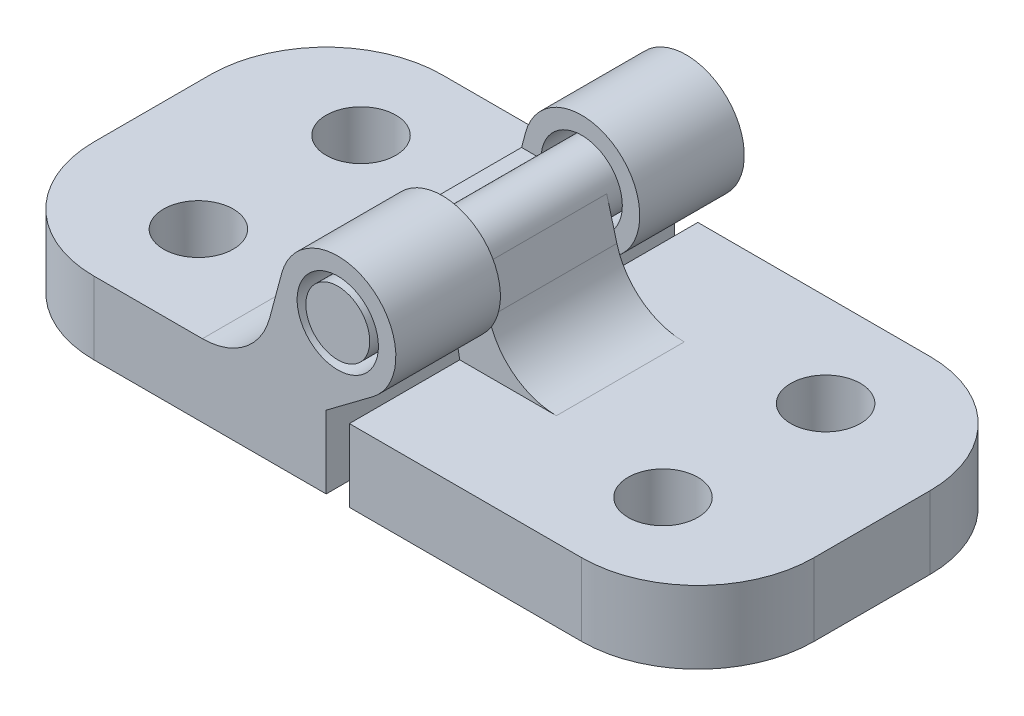
ISO-10303-21;
HEADER;
FILE_DESCRIPTION(('STEP AP214'),'2;1');
FILE_NAME('part.step','',(''),(''),'','','');
FILE_SCHEMA(('AUTOMOTIVE_DESIGN { 1 0 10303 214 1 1 1 1 }'));
ENDSEC;
DATA;
#1=APPLICATION_CONTEXT('core data for automotive mechanical design processes');
#2=APPLICATION_PROTOCOL_DEFINITION('international standard','automotive_design',2000,#1);
#3=PRODUCT_CONTEXT('',#1,'mechanical');
#4=PRODUCT('Part','Part','',(#3));
#5=PRODUCT_RELATED_PRODUCT_CATEGORY('part','',(#4));
#6=PRODUCT_DEFINITION_FORMATION('','',#4);
#7=PRODUCT_DEFINITION_CONTEXT('part definition',#1,'design');
#8=PRODUCT_DEFINITION('design','',#6,#7);
#9=PRODUCT_DEFINITION_SHAPE('','',#8);
#10=(LENGTH_UNIT() NAMED_UNIT(*) SI_UNIT(.MILLI.,.METRE.));
#11=(NAMED_UNIT(*) PLANE_ANGLE_UNIT() SI_UNIT($,.RADIAN.));
#12=(NAMED_UNIT(*) SI_UNIT($,.STERADIAN.) SOLID_ANGLE_UNIT());
#13=UNCERTAINTY_MEASURE_WITH_UNIT(LENGTH_MEASURE(1.E-05),#10,'distance_accuracy_value','');
#14=(GEOMETRIC_REPRESENTATION_CONTEXT(3) GLOBAL_UNCERTAINTY_ASSIGNED_CONTEXT((#13)) GLOBAL_UNIT_ASSIGNED_CONTEXT((#10,
#11,#12)) REPRESENTATION_CONTEXT('',''));
#15=CARTESIAN_POINT('',(0.,0.,0.));
#16=DIRECTION('',(0.,0.,1.));
#17=DIRECTION('',(1.,0.,0.));
#18=AXIS2_PLACEMENT_3D('',#15,#16,#17);
#19=CARTESIAN_POINT('',(15.501,3.375,2.75));
#20=DIRECTION('',(0.,0.,-1.));
#21=DIRECTION('',(-1.,0.,0.));
#22=AXIS2_PLACEMENT_3D('',#19,#20,#21);
#23=PLANE('',#22);
#24=CARTESIAN_POINT('',(0.,6.625,2.75));
#25=DIRECTION('',(0.,0.,-1.));
#26=DIRECTION('',(-1.,0.,0.));
#27=AXIS2_PLACEMENT_3D('',#24,#25,#26);
#28=CIRCLE('',#27,1.375);
#29=CARTESIAN_POINT('',(0.124312268872174,5.25563099939868,2.75));
#30=VERTEX_POINT('',#29);
#31=CARTESIAN_POINT('',(1.32814801114747,6.98087618701597,2.75));
#32=VERTEX_POINT('',#31);
#33=EDGE_CURVE('E209',#30,#32,#28,.F.);
#34=ORIENTED_EDGE('',*,*,#33,.F.);
#35=DIRECTION('',(-0.173648177666927,0.984807753012209,0.));
#36=VECTOR('',#35,1.);
#37=CARTESIAN_POINT('',(0.124312268872174,5.25563099939868,2.75));
#38=LINE('',#37,#36);
#39=CARTESIAN_POINT('',(0.499999999999995,3.125,2.75));
#40=VERTEX_POINT('',#39);
#41=EDGE_CURVE('E148',#40,#30,#38,.T.);
#42=ORIENTED_EDGE('',*,*,#41,.F.);
#43=DIRECTION('',(-1.,0.,0.));
#44=VECTOR('',#43,1.);
#45=CARTESIAN_POINT('',(0.499999999999996,3.125,2.75));
#46=LINE('',#45,#44);
#47=CARTESIAN_POINT('',(4.66330788550968,3.125,2.75));
#48=VERTEX_POINT('',#47);
#49=EDGE_CURVE('E72',#48,#40,#46,.T.);
#50=ORIENTED_EDGE('',*,*,#49,.F.);
#51=CARTESIAN_POINT('',(4.66330788550968,6.125,2.75));
#52=DIRECTION('',(0.,0.,-1.));
#53=DIRECTION('',(-1.,0.,0.));
#54=AXIS2_PLACEMENT_3D('',#51,#52,#53);
#55=CIRCLE('',#54,3.);
#56=CARTESIAN_POINT('',(1.76553040664248,5.34854286469243,2.75));
#57=VERTEX_POINT('',#56);
#58=EDGE_CURVE('E13',#48,#57,#55,.T.);
#59=ORIENTED_EDGE('',*,*,#58,.T.);
#60=DIRECTION('',(0.258819045102525,-0.965925826289067,0.));
#61=VECTOR('',#60,1.);
#62=CARTESIAN_POINT('',(2.36132692157281,3.125,2.75));
#63=LINE('',#62,#61);
#64=EDGE_CURVE('E150',#32,#57,#63,.T.);
#65=ORIENTED_EDGE('',*,*,#64,.F.);
#66=EDGE_LOOP('',(#34,#42,#50,#59,#65));
#67=FACE_BOUND('',#66,.T.);
#68=ADVANCED_FACE('F50',(#67),#23,.F.);
#69=CARTESIAN_POINT('',(0.,3.125,0.));
#70=DIRECTION('',(0.,1.,0.));
#71=DIRECTION('',(0.,0.,1.));
#72=AXIS2_PLACEMENT_3D('',#69,#70,#71);
#73=PLANE('',#72);
#74=CARTESIAN_POINT('',(10.,3.125,3.5));
#75=DIRECTION('',(0.,1.,0.));
#76=DIRECTION('',(0.,0.,1.));
#77=AXIS2_PLACEMENT_3D('',#74,#75,#76);
#78=CIRCLE('',#77,1.5);
#79=CARTESIAN_POINT('',(10.,3.125,5.));
#80=VERTEX_POINT('',#79);
#81=EDGE_CURVE('E306',#80,#80,#78,.T.);
#82=ORIENTED_EDGE('',*,*,#81,.F.);
#83=EDGE_LOOP('',(#82));
#84=FACE_BOUND('',#83,.T.);
#85=CARTESIAN_POINT('',(10.,3.125,-3.5));
#86=DIRECTION('',(0.,1.,0.));
#87=DIRECTION('',(0.,0.,-1.));
#88=AXIS2_PLACEMENT_3D('',#85,#86,#87);
#89=CIRCLE('',#88,1.5);
#90=CARTESIAN_POINT('',(10.,3.125,-5.));
#91=VERTEX_POINT('',#90);
#92=EDGE_CURVE('E319',#91,#91,#89,.T.);
#93=ORIENTED_EDGE('',*,*,#92,.F.);
#94=EDGE_LOOP('',(#93));
#95=FACE_BOUND('',#94,.T.);
#96=DIRECTION('',(-1.,0.,0.));
#97=VECTOR('',#96,1.);
#98=CARTESIAN_POINT('',(0.499999999999996,3.125,-2.75));
#99=LINE('',#98,#97);
#100=CARTESIAN_POINT('',(4.66330788550968,3.125,-2.75));
#101=VERTEX_POINT('',#100);
#102=CARTESIAN_POINT('',(0.499999999999996,3.125,-2.75));
#103=VERTEX_POINT('',#102);
#104=EDGE_CURVE('E65',#101,#103,#99,.T.);
#105=ORIENTED_EDGE('',*,*,#104,.F.);
#106=DIRECTION('',(0.,0.,-1.));
#107=VECTOR('',#106,1.);
#108=CARTESIAN_POINT('',(4.66330788550968,3.125,0.));
#109=LINE('',#108,#107);
#110=EDGE_CURVE('E187',#101,#48,#109,.F.);
#111=ORIENTED_EDGE('',*,*,#110,.T.);
#112=ORIENTED_EDGE('',*,*,#49,.T.);
#113=DIRECTION('',(0.,0.,-1.));
#114=VECTOR('',#113,1.);
#115=CARTESIAN_POINT('',(0.499999999999996,3.125,7.5));
#116=LINE('',#115,#114);
#117=CARTESIAN_POINT('',(0.499999999999996,3.125,7.5));
#118=VERTEX_POINT('',#117);
#119=EDGE_CURVE('E196',#118,#40,#116,.T.);
#120=ORIENTED_EDGE('',*,*,#119,.F.);
#121=DIRECTION('',(-1.,0.,0.));
#122=VECTOR('',#121,1.);
#123=CARTESIAN_POINT('',(15.5,3.125,7.5));
#124=LINE('',#123,#122);
#125=CARTESIAN_POINT('',(10.5,3.125,7.5));
#126=VERTEX_POINT('',#125);
#127=EDGE_CURVE('E220',#126,#118,#124,.T.);
#128=ORIENTED_EDGE('',*,*,#127,.F.);
#129=CARTESIAN_POINT('',(10.5,3.125,2.5));
#130=DIRECTION('',(0.,1.,0.));
#131=DIRECTION('',(0.,0.,1.));
#132=AXIS2_PLACEMENT_3D('',#129,#130,#131);
#133=CIRCLE('',#132,5.);
#134=CARTESIAN_POINT('',(15.5,3.125,2.5));
#135=VERTEX_POINT('',#134);
#136=EDGE_CURVE('E179',#126,#135,#133,.T.);
#137=ORIENTED_EDGE('',*,*,#136,.T.);
#138=DIRECTION('',(0.,0.,-1.));
#139=VECTOR('',#138,1.);
#140=CARTESIAN_POINT('',(15.5,3.125,7.5));
#141=LINE('',#140,#139);
#142=CARTESIAN_POINT('',(15.5,3.125,-2.5));
#143=VERTEX_POINT('',#142);
#144=EDGE_CURVE('E166',#135,#143,#141,.T.);
#145=ORIENTED_EDGE('',*,*,#144,.T.);
#146=CARTESIAN_POINT('',(10.5,3.125,-2.5));
#147=DIRECTION('',(0.,1.,0.));
#148=DIRECTION('',(0.,0.,1.));
#149=AXIS2_PLACEMENT_3D('',#146,#147,#148);
#150=CIRCLE('',#149,5.);
#151=CARTESIAN_POINT('',(10.5,3.125,-7.5));
#152=VERTEX_POINT('',#151);
#153=EDGE_CURVE('E177',#143,#152,#150,.T.);
#154=ORIENTED_EDGE('',*,*,#153,.T.);
#155=DIRECTION('',(-1.,0.,0.));
#156=VECTOR('',#155,1.);
#157=CARTESIAN_POINT('',(15.5,3.125,-7.5));
#158=LINE('',#157,#156);
#159=CARTESIAN_POINT('',(0.499999999999994,3.125,-7.5));
#160=VERTEX_POINT('',#159);
#161=EDGE_CURVE('E205',#152,#160,#158,.T.);
#162=ORIENTED_EDGE('',*,*,#161,.T.);
#163=EDGE_CURVE('E206',#103,#160,#116,.T.);
#164=ORIENTED_EDGE('',*,*,#163,.F.);
#165=EDGE_LOOP('',(#105,#111,#112,#120,#128,#137,#145,#154,#162,#164));
#166=FACE_BOUND('',#165,.T.);
#167=ADVANCED_FACE('F192',(#84,#95,#166),#73,.T.);
#168=CARTESIAN_POINT('',(15.5,3.125,7.5));
#169=DIRECTION('',(-1.,0.,0.));
#170=DIRECTION('',(0.,0.,1.));
#171=AXIS2_PLACEMENT_3D('',#168,#169,#170);
#172=PLANE('',#171);
#173=ORIENTED_EDGE('',*,*,#144,.F.);
#174=DIRECTION('',(0.,-1.,0.));
#175=VECTOR('',#174,1.);
#176=CARTESIAN_POINT('',(15.5,0.,2.5));
#177=LINE('',#176,#175);
#178=CARTESIAN_POINT('',(15.5,0.,2.5));
#179=VERTEX_POINT('',#178);
#180=EDGE_CURVE('E160',#135,#179,#177,.T.);
#181=ORIENTED_EDGE('',*,*,#180,.T.);
#182=DIRECTION('',(0.,0.,-1.));
#183=VECTOR('',#182,1.);
#184=CARTESIAN_POINT('',(15.5,0.,7.5));
#185=LINE('',#184,#183);
#186=CARTESIAN_POINT('',(15.5,0.,-2.5));
#187=VERTEX_POINT('',#186);
#188=EDGE_CURVE('E158',#179,#187,#185,.T.);
#189=ORIENTED_EDGE('',*,*,#188,.T.);
#190=DIRECTION('',(0.,-1.,0.));
#191=VECTOR('',#190,1.);
#192=CARTESIAN_POINT('',(15.5,3.125,-2.5));
#193=LINE('',#192,#191);
#194=EDGE_CURVE('E157',#187,#143,#193,.F.);
#195=ORIENTED_EDGE('',*,*,#194,.T.);
#196=EDGE_LOOP('',(#173,#181,#189,#195));
#197=FACE_BOUND('',#196,.T.);
#198=ADVANCED_FACE('F251',(#197),#172,.F.);
#199=CARTESIAN_POINT('',(15.5,3.125,-7.5));
#200=DIRECTION('',(0.,0.,1.));
#201=DIRECTION('',(1.,0.,0.));
#202=AXIS2_PLACEMENT_3D('',#199,#200,#201);
#203=PLANE('',#202);
#204=ORIENTED_EDGE('',*,*,#161,.F.);
#205=DIRECTION('',(0.,-1.,0.));
#206=VECTOR('',#205,1.);
#207=CARTESIAN_POINT('',(10.5,3.125,-7.5));
#208=LINE('',#207,#206);
#209=CARTESIAN_POINT('',(10.5,0.,-7.5));
#210=VERTEX_POINT('',#209);
#211=EDGE_CURVE('E181',#152,#210,#208,.T.);
#212=ORIENTED_EDGE('',*,*,#211,.T.);
#213=DIRECTION('',(-1.,0.,0.));
#214=VECTOR('',#213,1.);
#215=CARTESIAN_POINT('',(15.5,0.,-7.5));
#216=LINE('',#215,#214);
#217=CARTESIAN_POINT('',(0.499999999999994,0.,-7.5));
#218=VERTEX_POINT('',#217);
#219=EDGE_CURVE('E163',#210,#218,#216,.T.);
#220=ORIENTED_EDGE('',*,*,#219,.T.);
#221=DIRECTION('',(0.,-1.,0.));
#222=VECTOR('',#221,1.);
#223=CARTESIAN_POINT('',(0.499999999999994,3.125,-7.5));
#224=LINE('',#223,#222);
#225=EDGE_CURVE('E210',#160,#218,#224,.T.);
#226=ORIENTED_EDGE('',*,*,#225,.F.);
#227=EDGE_LOOP('',(#204,#212,#220,#226));
#228=FACE_BOUND('',#227,.T.);
#229=ADVANCED_FACE('F240',(#228),#203,.F.);
#230=CARTESIAN_POINT('',(0.499999999999996,3.125,7.5));
#231=DIRECTION('',(-1.,0.,0.));
#232=DIRECTION('',(0.,0.,1.));
#233=AXIS2_PLACEMENT_3D('',#230,#231,#232);
#234=PLANE('',#233);
#235=DIRECTION('',(0.,0.,-1.));
#236=VECTOR('',#235,1.);
#237=CARTESIAN_POINT('',(0.499999999999996,0.,7.5));
#238=LINE('',#237,#236);
#239=CARTESIAN_POINT('',(0.499999999999996,0.,7.5));
#240=VERTEX_POINT('',#239);
#241=EDGE_CURVE('E223',#240,#218,#238,.T.);
#242=ORIENTED_EDGE('',*,*,#241,.F.);
#243=DIRECTION('',(0.,-1.,0.));
#244=VECTOR('',#243,1.);
#245=CARTESIAN_POINT('',(0.499999999999996,3.125,7.5));
#246=LINE('',#245,#244);
#247=EDGE_CURVE('E204',#118,#240,#246,.T.);
#248=ORIENTED_EDGE('',*,*,#247,.F.);
#249=ORIENTED_EDGE('',*,*,#119,.T.);
#250=DIRECTION('',(0.,0.,-1.));
#251=VECTOR('',#250,1.);
#252=CARTESIAN_POINT('',(0.499999999999996,3.125,9.14213023835133));
#253=LINE('',#252,#251);
#254=EDGE_CURVE('E151',#40,#103,#253,.T.);
#255=ORIENTED_EDGE('',*,*,#254,.T.);
#256=ORIENTED_EDGE('',*,*,#163,.T.);
#257=ORIENTED_EDGE('',*,*,#225,.T.);
#258=EDGE_LOOP('',(#242,#248,#249,#255,#256,#257));
#259=FACE_BOUND('',#258,.T.);
#260=ADVANCED_FACE('F201',(#259),#234,.T.);
#261=CARTESIAN_POINT('',(15.5,3.125,7.5));
#262=DIRECTION('',(0.,0.,1.));
#263=DIRECTION('',(1.,0.,0.));
#264=AXIS2_PLACEMENT_3D('',#261,#262,#263);
#265=PLANE('',#264);
#266=DIRECTION('',(-1.,0.,0.));
#267=VECTOR('',#266,1.);
#268=CARTESIAN_POINT('',(15.5,0.,7.5));
#269=LINE('',#268,#267);
#270=CARTESIAN_POINT('',(10.5,0.,7.5));
#271=VERTEX_POINT('',#270);
#272=EDGE_CURVE('E221',#271,#240,#269,.T.);
#273=ORIENTED_EDGE('',*,*,#272,.F.);
#274=DIRECTION('',(0.,-1.,0.));
#275=VECTOR('',#274,1.);
#276=CARTESIAN_POINT('',(10.5,3.125,7.5));
#277=LINE('',#276,#275);
#278=EDGE_CURVE('E175',#271,#126,#277,.F.);
#279=ORIENTED_EDGE('',*,*,#278,.T.);
#280=ORIENTED_EDGE('',*,*,#127,.T.);
#281=ORIENTED_EDGE('',*,*,#247,.T.);
#282=EDGE_LOOP('',(#273,#279,#280,#281));
#283=FACE_BOUND('',#282,.T.);
#284=ADVANCED_FACE('F248',(#283),#265,.T.);
#285=CARTESIAN_POINT('',(0.,0.,0.));
#286=DIRECTION('',(0.,1.,0.));
#287=DIRECTION('',(0.,0.,1.));
#288=AXIS2_PLACEMENT_3D('',#285,#286,#287);
#289=PLANE('',#288);
#290=CARTESIAN_POINT('',(10.,0.,3.5));
#291=DIRECTION('',(0.,1.,0.));
#292=DIRECTION('',(0.,0.,1.));
#293=AXIS2_PLACEMENT_3D('',#290,#291,#292);
#294=CIRCLE('',#293,1.5);
#295=CARTESIAN_POINT('',(10.,0.,5.));
#296=VERTEX_POINT('',#295);
#297=EDGE_CURVE('E309',#296,#296,#294,.F.);
#298=ORIENTED_EDGE('',*,*,#297,.F.);
#299=EDGE_LOOP('',(#298));
#300=FACE_BOUND('',#299,.T.);
#301=CARTESIAN_POINT('',(10.,0.,-3.5));
#302=DIRECTION('',(0.,1.,0.));
#303=DIRECTION('',(0.,0.,1.));
#304=AXIS2_PLACEMENT_3D('',#301,#302,#303);
#305=CIRCLE('',#304,1.5);
#306=CARTESIAN_POINT('',(10.,0.,-2.));
#307=VERTEX_POINT('',#306);
#308=EDGE_CURVE('E316',#307,#307,#305,.F.);
#309=ORIENTED_EDGE('',*,*,#308,.F.);
#310=EDGE_LOOP('',(#309));
#311=FACE_BOUND('',#310,.T.);
#312=ORIENTED_EDGE('',*,*,#188,.F.);
#313=CARTESIAN_POINT('',(10.5,0.,2.5));
#314=DIRECTION('',(0.,1.,0.));
#315=DIRECTION('',(0.,0.,1.));
#316=AXIS2_PLACEMENT_3D('',#313,#314,#315);
#317=CIRCLE('',#316,5.);
#318=EDGE_CURVE('E173',#179,#271,#317,.F.);
#319=ORIENTED_EDGE('',*,*,#318,.T.);
#320=ORIENTED_EDGE('',*,*,#272,.T.);
#321=ORIENTED_EDGE('',*,*,#241,.T.);
#322=ORIENTED_EDGE('',*,*,#219,.F.);
#323=CARTESIAN_POINT('',(10.5,0.,-2.5));
#324=DIRECTION('',(0.,1.,0.));
#325=DIRECTION('',(0.,0.,1.));
#326=AXIS2_PLACEMENT_3D('',#323,#324,#325);
#327=CIRCLE('',#326,5.);
#328=EDGE_CURVE('E171',#210,#187,#327,.F.);
#329=ORIENTED_EDGE('',*,*,#328,.T.);
#330=EDGE_LOOP('',(#312,#319,#320,#321,#322,#329));
#331=FACE_BOUND('',#330,.T.);
#332=ADVANCED_FACE('F244',(#300,#311,#331),#289,.F.);
#333=CARTESIAN_POINT('',(2.36132692157281,3.125,9.14213023835133));
#334=DIRECTION('',(-0.965925826289067,-0.258819045102525,0.));
#335=DIRECTION('',(0.258819045102525,-0.965925826289067,0.));
#336=AXIS2_PLACEMENT_3D('',#333,#334,#335);
#337=PLANE('',#336);
#338=ORIENTED_EDGE('',*,*,#64,.T.);
#339=DIRECTION('',(0.,0.,-1.));
#340=VECTOR('',#339,1.);
#341=CARTESIAN_POINT('',(1.76553040664248,5.34854286469243,9.14213023835133));
#342=LINE('',#341,#340);
#343=CARTESIAN_POINT('',(1.76553040664248,5.34854286469243,-2.75));
#344=VERTEX_POINT('',#343);
#345=EDGE_CURVE('E184',#57,#344,#342,.T.);
#346=ORIENTED_EDGE('',*,*,#345,.T.);
#347=DIRECTION('',(0.258819045102525,-0.965925826289067,0.));
#348=VECTOR('',#347,1.);
#349=CARTESIAN_POINT('',(2.36132692157281,3.125,-2.75));
#350=LINE('',#349,#348);
#351=CARTESIAN_POINT('',(1.32814801114747,6.98087618701597,-2.75));
#352=VERTEX_POINT('',#351);
#353=EDGE_CURVE('E142',#352,#344,#350,.T.);
#354=ORIENTED_EDGE('',*,*,#353,.F.);
#355=DIRECTION('',(0.,0.,-1.));
#356=VECTOR('',#355,1.);
#357=CARTESIAN_POINT('',(1.32814801114747,6.98087618701597,9.14213023835133));
#358=LINE('',#357,#356);
#359=EDGE_CURVE('E141',#32,#352,#358,.T.);
#360=ORIENTED_EDGE('',*,*,#359,.F.);
#361=EDGE_LOOP('',(#338,#346,#354,#360));
#362=FACE_BOUND('',#361,.T.);
#363=ADVANCED_FACE('F272',(#362),#337,.F.);
#364=CARTESIAN_POINT('',(0.124312268872174,5.25563099939868,9.14213023835133));
#365=DIRECTION('',(0.984807753012209,0.173648177666927,0.));
#366=DIRECTION('',(-0.173648177666927,0.984807753012209,0.));
#367=AXIS2_PLACEMENT_3D('',#364,#365,#366);
#368=PLANE('',#367);
#369=ORIENTED_EDGE('',*,*,#254,.F.);
#370=ORIENTED_EDGE('',*,*,#41,.T.);
#371=DIRECTION('',(0.,0.,-1.));
#372=VECTOR('',#371,1.);
#373=CARTESIAN_POINT('',(0.124312268872174,5.25563099939868,9.14213023835133));
#374=LINE('',#373,#372);
#375=CARTESIAN_POINT('',(0.124312268872174,5.25563099939868,-2.75));
#376=VERTEX_POINT('',#375);
#377=EDGE_CURVE('E146',#30,#376,#374,.T.);
#378=ORIENTED_EDGE('',*,*,#377,.T.);
#379=DIRECTION('',(-0.173648177666927,0.984807753012209,0.));
#380=VECTOR('',#379,1.);
#381=CARTESIAN_POINT('',(0.124312268872174,5.25563099939868,-2.75));
#382=LINE('',#381,#380);
#383=EDGE_CURVE('E132',#103,#376,#382,.T.);
#384=ORIENTED_EDGE('',*,*,#383,.F.);
#385=EDGE_LOOP('',(#369,#370,#378,#384));
#386=FACE_BOUND('',#385,.T.);
#387=ADVANCED_FACE('F147',(#386),#368,.F.);
#388=CARTESIAN_POINT('',(0.,6.625,9.14213023835133));
#389=DIRECTION('',(0.,0.,-1.));
#390=DIRECTION('',(-1.,0.,0.));
#391=AXIS2_PLACEMENT_3D('',#388,#389,#390);
#392=CYLINDRICAL_SURFACE('',#391,1.375);
#393=ORIENTED_EDGE('',*,*,#377,.F.);
#394=ORIENTED_EDGE('',*,*,#33,.T.);
#395=ORIENTED_EDGE('',*,*,#359,.T.);
#396=CARTESIAN_POINT('',(0.,6.625,-2.75));
#397=DIRECTION('',(0.,0.,1.));
#398=DIRECTION('',(1.,0.,0.));
#399=AXIS2_PLACEMENT_3D('',#396,#397,#398);
#400=CIRCLE('',#399,1.375);
#401=EDGE_CURVE('E137',#352,#376,#400,.F.);
#402=ORIENTED_EDGE('',*,*,#401,.T.);
#403=EDGE_LOOP('',(#393,#394,#395,#402));
#404=FACE_BOUND('',#403,.T.);
#405=CARTESIAN_POINT('',(0.,6.625,-7.5));
#406=DIRECTION('',(0.,0.,-1.));
#407=DIRECTION('',(-1.,0.,0.));
#408=AXIS2_PLACEMENT_3D('',#405,#406,#407);
#409=CIRCLE('',#408,1.375);
#410=CARTESIAN_POINT('',(-1.375,6.625,-7.5));
#411=VERTEX_POINT('',#410);
#412=EDGE_CURVE('E311',#411,#411,#409,.F.);
#413=ORIENTED_EDGE('',*,*,#412,.T.);
#414=EDGE_LOOP('',(#413));
#415=FACE_BOUND('',#414,.T.);
#416=CARTESIAN_POINT('',(0.,6.625,7.5));
#417=DIRECTION('',(0.,0.,-1.));
#418=DIRECTION('',(-1.,0.,0.));
#419=AXIS2_PLACEMENT_3D('',#416,#417,#418);
#420=CIRCLE('',#419,1.375);
#421=CARTESIAN_POINT('',(-1.375,6.625,7.5));
#422=VERTEX_POINT('',#421);
#423=EDGE_CURVE('E314',#422,#422,#420,.T.);
#424=ORIENTED_EDGE('',*,*,#423,.T.);
#425=EDGE_LOOP('',(#424));
#426=FACE_BOUND('',#425,.T.);
#427=ADVANCED_FACE('F153',(#404,#415,#426),#392,.T.);
#428=CARTESIAN_POINT('',(15.501,3.375,-2.75));
#429=DIRECTION('',(0.,0.,1.));
#430=DIRECTION('',(1.,0.,0.));
#431=AXIS2_PLACEMENT_3D('',#428,#429,#430);
#432=PLANE('',#431);
#433=ORIENTED_EDGE('',*,*,#401,.F.);
#434=ORIENTED_EDGE('',*,*,#353,.T.);
#435=CARTESIAN_POINT('',(4.66330788550968,6.125,-2.75));
#436=DIRECTION('',(0.,0.,1.));
#437=DIRECTION('',(1.,0.,0.));
#438=AXIS2_PLACEMENT_3D('',#435,#436,#437);
#439=CIRCLE('',#438,3.);
#440=EDGE_CURVE('E58',#344,#101,#439,.T.);
#441=ORIENTED_EDGE('',*,*,#440,.T.);
#442=ORIENTED_EDGE('',*,*,#104,.T.);
#443=ORIENTED_EDGE('',*,*,#383,.T.);
#444=EDGE_LOOP('',(#433,#434,#441,#442,#443));
#445=FACE_BOUND('',#444,.T.);
#446=ADVANCED_FACE('F134',(#445),#432,.F.);
#447=CARTESIAN_POINT('',(-15.5,3.125,-7.5));
#448=DIRECTION('',(0.,0.,-1.));
#449=DIRECTION('',(-1.,0.,0.));
#450=AXIS2_PLACEMENT_3D('',#447,#448,#449);
#451=PLANE('',#450);
#452=ORIENTED_EDGE('',*,*,#412,.F.);
#453=EDGE_LOOP('',(#452));
#454=FACE_BOUND('',#453,.T.);
#455=ADVANCED_FACE('F280',(#454),#451,.T.);
#456=CARTESIAN_POINT('',(-15.5,3.125,7.5));
#457=DIRECTION('',(0.,0.,-1.));
#458=DIRECTION('',(-1.,0.,0.));
#459=AXIS2_PLACEMENT_3D('',#456,#457,#458);
#460=PLANE('',#459);
#461=ORIENTED_EDGE('',*,*,#423,.F.);
#462=EDGE_LOOP('',(#461));
#463=FACE_BOUND('',#462,.T.);
#464=ADVANCED_FACE('F284',(#463),#460,.F.);
#465=CARTESIAN_POINT('',(10.,-0.00100000000000013,-3.5));
#466=DIRECTION('',(0.,1.,0.));
#467=DIRECTION('',(0.,0.,1.));
#468=AXIS2_PLACEMENT_3D('',#465,#466,#467);
#469=CYLINDRICAL_SURFACE('',#468,1.5);
#470=ORIENTED_EDGE('',*,*,#92,.T.);
#471=EDGE_LOOP('',(#470));
#472=FACE_BOUND('',#471,.T.);
#473=ORIENTED_EDGE('',*,*,#308,.T.);
#474=EDGE_LOOP('',(#473));
#475=FACE_BOUND('',#474,.T.);
#476=ADVANCED_FACE('F290',(#472,#475),#469,.F.);
#477=CARTESIAN_POINT('',(10.,-0.00100000000000013,3.5));
#478=DIRECTION('',(0.,1.,0.));
#479=DIRECTION('',(0.,0.,1.));
#480=AXIS2_PLACEMENT_3D('',#477,#478,#479);
#481=CYLINDRICAL_SURFACE('',#480,1.5);
#482=ORIENTED_EDGE('',*,*,#81,.T.);
#483=EDGE_LOOP('',(#482));
#484=FACE_BOUND('',#483,.T.);
#485=ORIENTED_EDGE('',*,*,#297,.T.);
#486=EDGE_LOOP('',(#485));
#487=FACE_BOUND('',#486,.T.);
#488=ADVANCED_FACE('F296',(#484,#487),#481,.F.);
#489=CARTESIAN_POINT('',(10.5,3.125,2.5));
#490=DIRECTION('',(0.,1.,0.));
#491=DIRECTION('',(0.,0.,1.));
#492=AXIS2_PLACEMENT_3D('',#489,#490,#491);
#493=CYLINDRICAL_SURFACE('',#492,5.);
#494=ORIENTED_EDGE('',*,*,#136,.F.);
#495=ORIENTED_EDGE('',*,*,#278,.F.);
#496=ORIENTED_EDGE('',*,*,#318,.F.);
#497=ORIENTED_EDGE('',*,*,#180,.F.);
#498=EDGE_LOOP('',(#494,#495,#496,#497));
#499=FACE_BOUND('',#498,.T.);
#500=ADVANCED_FACE('F250',(#499),#493,.T.);
#501=CARTESIAN_POINT('',(10.5,3.125,-2.5));
#502=DIRECTION('',(0.,-1.,0.));
#503=DIRECTION('',(0.,0.,-1.));
#504=AXIS2_PLACEMENT_3D('',#501,#502,#503);
#505=CYLINDRICAL_SURFACE('',#504,5.);
#506=ORIENTED_EDGE('',*,*,#153,.F.);
#507=ORIENTED_EDGE('',*,*,#194,.F.);
#508=ORIENTED_EDGE('',*,*,#328,.F.);
#509=ORIENTED_EDGE('',*,*,#211,.F.);
#510=EDGE_LOOP('',(#506,#507,#508,#509));
#511=FACE_BOUND('',#510,.T.);
#512=ADVANCED_FACE('F237',(#511),#505,.T.);
#513=CARTESIAN_POINT('',(4.66330788550968,6.125,9.14213023835133));
#514=DIRECTION('',(0.,0.,-1.));
#515=DIRECTION('',(-1.,0.,0.));
#516=AXIS2_PLACEMENT_3D('',#513,#514,#515);
#517=CYLINDRICAL_SURFACE('',#516,3.);
#518=ORIENTED_EDGE('',*,*,#58,.F.);
#519=ORIENTED_EDGE('',*,*,#110,.F.);
#520=ORIENTED_EDGE('',*,*,#440,.F.);
#521=ORIENTED_EDGE('',*,*,#345,.F.);
#522=EDGE_LOOP('',(#518,#519,#520,#521));
#523=FACE_BOUND('',#522,.T.);
#524=ADVANCED_FACE('F52',(#523),#517,.F.);
#525=CLOSED_SHELL('',(#68,#167,#198,#229,#260,#284,#332,#363,#387,#427,#446,#455,#464,#476,#488,
#500,#512,#524));
#526=MANIFOLD_SOLID_BREP('B2',#525);
#527=CARTESIAN_POINT('',(0.,6.625,-16.0036949704846));
#528=DIRECTION('',(0.,0.,1.));
#529=DIRECTION('',(1.,0.,0.));
#530=AXIS2_PLACEMENT_3D('',#527,#528,#529);
#531=CYLINDRICAL_SURFACE('',#530,2.5);
#532=CARTESIAN_POINT('',(0.,6.625,3.));
#533=DIRECTION('',(0.,0.,-1.));
#534=DIRECTION('',(-1.,0.,0.));
#535=AXIS2_PLACEMENT_3D('',#532,#533,#534);
#536=CIRCLE('',#535,2.5);
#537=CARTESIAN_POINT('',(-2.41481456572267,7.27204761275631,3.));
#538=VERTEX_POINT('',#537);
#539=CARTESIAN_POINT('',(1.5,4.625,3.));
#540=VERTEX_POINT('',#539);
#541=EDGE_CURVE('E570',#538,#540,#536,.T.);
#542=ORIENTED_EDGE('',*,*,#541,.F.);
#543=DIRECTION('',(0.,0.,1.));
#544=VECTOR('',#543,1.);
#545=CARTESIAN_POINT('',(-2.41481456572267,7.27204761275631,-16.0036949704846));
#546=LINE('',#545,#544);
#547=CARTESIAN_POINT('',(-2.41481456572267,7.27204761275631,7.5));
#548=VERTEX_POINT('',#547);
#549=EDGE_CURVE('E587',#538,#548,#546,.T.);
#550=ORIENTED_EDGE('',*,*,#549,.T.);
#551=CARTESIAN_POINT('',(0.,6.625,7.5));
#552=DIRECTION('',(0.,0.,1.));
#553=DIRECTION('',(1.,0.,0.));
#554=AXIS2_PLACEMENT_3D('',#551,#552,#553);
#555=CIRCLE('',#554,2.5);
#556=CARTESIAN_POINT('',(1.5,4.625,7.5));
#557=VERTEX_POINT('',#556);
#558=EDGE_CURVE('E658',#557,#548,#555,.T.);
#559=ORIENTED_EDGE('',*,*,#558,.F.);
#560=DIRECTION('',(0.,0.,1.));
#561=VECTOR('',#560,1.);
#562=CARTESIAN_POINT('',(1.5,4.625,-16.0036949704846));
#563=LINE('',#562,#561);
#564=EDGE_CURVE('E590',#540,#557,#563,.T.);
#565=ORIENTED_EDGE('',*,*,#564,.F.);
#566=EDGE_LOOP('',(#542,#550,#559,#565));
#567=FACE_BOUND('',#566,.T.);
#568=ADVANCED_FACE('F444',(#567),#531,.T.);
#569=CARTESIAN_POINT('',(-2.41481456572267,7.27204761275631,-7.5));
#570=VERTEX_POINT('',#569);
#571=CARTESIAN_POINT('',(-2.41481456572267,7.27204761275631,-3.));
#572=VERTEX_POINT('',#571);
#573=EDGE_CURVE('E577',#570,#572,#546,.T.);
#574=ORIENTED_EDGE('',*,*,#573,.T.);
#575=CARTESIAN_POINT('',(0.,6.625,-3.));
#576=DIRECTION('',(0.,0.,1.));
#577=DIRECTION('',(1.,0.,0.));
#578=AXIS2_PLACEMENT_3D('',#575,#576,#577);
#579=CIRCLE('',#578,2.5);
#580=CARTESIAN_POINT('',(1.5,4.625,-3.));
#581=VERTEX_POINT('',#580);
#582=EDGE_CURVE('E556',#581,#572,#579,.T.);
#583=ORIENTED_EDGE('',*,*,#582,.F.);
#584=CARTESIAN_POINT('',(1.5,4.625,-7.5));
#585=VERTEX_POINT('',#584);
#586=EDGE_CURVE('E595',#585,#581,#563,.T.);
#587=ORIENTED_EDGE('',*,*,#586,.F.);
#588=CARTESIAN_POINT('',(0.,6.625,-7.5));
#589=DIRECTION('',(0.,0.,-1.));
#590=DIRECTION('',(-1.,0.,0.));
#591=AXIS2_PLACEMENT_3D('',#588,#589,#590);
#592=CIRCLE('',#591,2.5);
#593=EDGE_CURVE('E585',#585,#570,#592,.F.);
#594=ORIENTED_EDGE('',*,*,#593,.T.);
#595=EDGE_LOOP('',(#574,#583,#587,#594));
#596=FACE_BOUND('',#595,.T.);
#597=ADVANCED_FACE('F584',(#596),#531,.T.);
#598=CARTESIAN_POINT('',(-0.500000000000008,3.125,-16.0036949704846));
#599=DIRECTION('',(0.599999999999999,-0.800000000000001,0.));
#600=DIRECTION('',(0.800000000000001,0.599999999999999,0.));
#601=AXIS2_PLACEMENT_3D('',#598,#599,#600);
#602=PLANE('',#601);
#603=ORIENTED_EDGE('',*,*,#586,.T.);
#604=DIRECTION('',(0.800000000000001,0.599999999999999,0.));
#605=VECTOR('',#604,1.);
#606=CARTESIAN_POINT('',(9.86064000000001,10.89548,-3.));
#607=LINE('',#606,#605);
#608=CARTESIAN_POINT('',(0.,3.5,-3.));
#609=VERTEX_POINT('',#608);
#610=EDGE_CURVE('E564',#609,#581,#607,.T.);
#611=ORIENTED_EDGE('',*,*,#610,.F.);
#612=DIRECTION('',(0.,0.,1.));
#613=VECTOR('',#612,1.);
#614=CARTESIAN_POINT('',(0.,3.5,0.));
#615=LINE('',#614,#613);
#616=CARTESIAN_POINT('',(0.,3.50000000000001,3.));
#617=VERTEX_POINT('',#616);
#618=EDGE_CURVE('E665',#609,#617,#615,.T.);
#619=ORIENTED_EDGE('',*,*,#618,.T.);
#620=DIRECTION('',(-0.800000000000001,-0.599999999999999,0.));
#621=VECTOR('',#620,1.);
#622=CARTESIAN_POINT('',(9.86064000000001,10.89548,3.));
#623=LINE('',#622,#621);
#624=EDGE_CURVE('E684',#540,#617,#623,.T.);
#625=ORIENTED_EDGE('',*,*,#624,.F.);
#626=ORIENTED_EDGE('',*,*,#564,.T.);
#627=DIRECTION('',(0.800000000000001,0.599999999999999,0.));
#628=VECTOR('',#627,1.);
#629=CARTESIAN_POINT('',(-0.500000000000008,3.125,7.5));
#630=LINE('',#629,#628);
#631=CARTESIAN_POINT('',(-0.499999999999996,3.125,7.5));
#632=VERTEX_POINT('',#631);
#633=EDGE_CURVE('E662',#632,#557,#630,.T.);
#634=ORIENTED_EDGE('',*,*,#633,.F.);
#635=DIRECTION('',(0.,0.,-1.));
#636=VECTOR('',#635,1.);
#637=CARTESIAN_POINT('',(-0.499999999999996,3.125,7.5));
#638=LINE('',#637,#636);
#639=CARTESIAN_POINT('',(-0.499999999999994,3.125,-7.5));
#640=VERTEX_POINT('',#639);
#641=EDGE_CURVE('E600',#632,#640,#638,.T.);
#642=ORIENTED_EDGE('',*,*,#641,.T.);
#643=DIRECTION('',(0.800000000000001,0.599999999999999,0.));
#644=VECTOR('',#643,1.);
#645=CARTESIAN_POINT('',(-0.500000000000009,3.125,-7.5));
#646=LINE('',#645,#644);
#647=EDGE_CURVE('E586',#640,#585,#646,.T.);
#648=ORIENTED_EDGE('',*,*,#647,.T.);
#649=EDGE_LOOP('',(#603,#611,#619,#625,#626,#634,#642,#648));
#650=FACE_BOUND('',#649,.T.);
#651=ADVANCED_FACE('F748',(#650),#602,.T.);
#652=CARTESIAN_POINT('',(-15.5,3.125,7.5));
#653=DIRECTION('',(0.,0.,-1.));
#654=DIRECTION('',(-1.,0.,0.));
#655=AXIS2_PLACEMENT_3D('',#652,#653,#654);
#656=PLANE('',#655);
#657=DIRECTION('',(1.,0.,0.));
#658=VECTOR('',#657,1.);
#659=CARTESIAN_POINT('',(-15.5,3.125,7.5));
#660=LINE('',#659,#658);
#661=CARTESIAN_POINT('',(-10.5,3.125,7.5));
#662=VERTEX_POINT('',#661);
#663=CARTESIAN_POINT('',(-5.82799358847103,3.125,7.5));
#664=VERTEX_POINT('',#663);
#665=EDGE_CURVE('E598',#662,#664,#660,.T.);
#666=ORIENTED_EDGE('',*,*,#665,.F.);
#667=DIRECTION('',(0.,-1.,0.));
#668=VECTOR('',#667,1.);
#669=CARTESIAN_POINT('',(-10.5,0.,7.5));
#670=LINE('',#669,#668);
#671=CARTESIAN_POINT('',(-10.5,0.,7.5));
#672=VERTEX_POINT('',#671);
#673=EDGE_CURVE('E640',#662,#672,#670,.T.);
#674=ORIENTED_EDGE('',*,*,#673,.T.);
#675=DIRECTION('',(1.,0.,0.));
#676=VECTOR('',#675,1.);
#677=CARTESIAN_POINT('',(-15.5,0.,7.5));
#678=LINE('',#677,#676);
#679=CARTESIAN_POINT('',(-0.499999999999996,0.,7.5));
#680=VERTEX_POINT('',#679);
#681=EDGE_CURVE('E610',#672,#680,#678,.T.);
#682=ORIENTED_EDGE('',*,*,#681,.T.);
#683=DIRECTION('',(0.,-1.,0.));
#684=VECTOR('',#683,1.);
#685=CARTESIAN_POINT('',(-0.499999999999996,3.125,7.5));
#686=LINE('',#685,#684);
#687=EDGE_CURVE('E622',#632,#680,#686,.T.);
#688=ORIENTED_EDGE('',*,*,#687,.F.);
#689=ORIENTED_EDGE('',*,*,#633,.T.);
#690=ORIENTED_EDGE('',*,*,#558,.T.);
#691=DIRECTION('',(-0.258819045102525,-0.965925826289067,0.));
#692=VECTOR('',#691,1.);
#693=CARTESIAN_POINT('',(-2.41481456572267,7.27204761275631,7.5));
#694=LINE('',#693,#692);
#695=CARTESIAN_POINT('',(-2.93021610960383,5.34854286469243,7.5));
#696=VERTEX_POINT('',#695);
#697=EDGE_CURVE('E649',#548,#696,#694,.T.);
#698=ORIENTED_EDGE('',*,*,#697,.T.);
#699=CARTESIAN_POINT('',(-5.82799358847103,6.125,7.5));
#700=DIRECTION('',(0.,0.,-1.));
#701=DIRECTION('',(-1.,0.,0.));
#702=AXIS2_PLACEMENT_3D('',#699,#700,#701);
#703=CIRCLE('',#702,3.);
#704=EDGE_CURVE('E452',#696,#664,#703,.T.);
#705=ORIENTED_EDGE('',*,*,#704,.T.);
#706=EDGE_LOOP('',(#666,#674,#682,#688,#689,#690,#698,#705));
#707=FACE_BOUND('',#706,.T.);
#708=CARTESIAN_POINT('',(0.,6.625,7.5));
#709=DIRECTION('',(0.,0.,1.));
#710=DIRECTION('',(1.,0.,0.));
#711=AXIS2_PLACEMENT_3D('',#708,#709,#710);
#712=CIRCLE('',#711,1.75);
#713=CARTESIAN_POINT('',(1.75,6.625,7.5));
#714=VERTEX_POINT('',#713);
#715=EDGE_CURVE('E597',#714,#714,#712,.T.);
#716=ORIENTED_EDGE('',*,*,#715,.F.);
#717=EDGE_LOOP('',(#716));
#718=FACE_BOUND('',#717,.T.);
#719=ADVANCED_FACE('F654',(#707,#718),#656,.F.);
#720=CARTESIAN_POINT('',(-0.499999999999996,3.125,7.5));
#721=DIRECTION('',(-1.,0.,0.));
#722=DIRECTION('',(0.,0.,1.));
#723=AXIS2_PLACEMENT_3D('',#720,#721,#722);
#724=PLANE('',#723);
#725=DIRECTION('',(0.,0.,-1.));
#726=VECTOR('',#725,1.);
#727=CARTESIAN_POINT('',(-0.499999999999996,0.,7.5));
#728=LINE('',#727,#726);
#729=CARTESIAN_POINT('',(-0.499999999999994,0.,-7.5));
#730=VERTEX_POINT('',#729);
#731=EDGE_CURVE('E612',#680,#730,#728,.T.);
#732=ORIENTED_EDGE('',*,*,#731,.T.);
#733=DIRECTION('',(0.,-1.,0.));
#734=VECTOR('',#733,1.);
#735=CARTESIAN_POINT('',(-0.499999999999994,3.125,-7.5));
#736=LINE('',#735,#734);
#737=EDGE_CURVE('E609',#640,#730,#736,.T.);
#738=ORIENTED_EDGE('',*,*,#737,.F.);
#739=ORIENTED_EDGE('',*,*,#641,.F.);
#740=ORIENTED_EDGE('',*,*,#687,.T.);
#741=EDGE_LOOP('',(#732,#738,#739,#740));
#742=FACE_BOUND('',#741,.T.);
#743=ADVANCED_FACE('F746',(#742),#724,.F.);
#744=CARTESIAN_POINT('',(-15.5,3.125,-7.5));
#745=DIRECTION('',(0.,0.,-1.));
#746=DIRECTION('',(-1.,0.,0.));
#747=AXIS2_PLACEMENT_3D('',#744,#745,#746);
#748=PLANE('',#747);
#749=DIRECTION('',(1.,0.,0.));
#750=VECTOR('',#749,1.);
#751=CARTESIAN_POINT('',(-15.5,0.,-7.5));
#752=LINE('',#751,#750);
#753=CARTESIAN_POINT('',(-10.5,0.,-7.5));
#754=VERTEX_POINT('',#753);
#755=EDGE_CURVE('E616',#754,#730,#752,.T.);
#756=ORIENTED_EDGE('',*,*,#755,.F.);
#757=DIRECTION('',(0.,-1.,0.));
#758=VECTOR('',#757,1.);
#759=CARTESIAN_POINT('',(-10.5,3.125,-7.5));
#760=LINE('',#759,#758);
#761=CARTESIAN_POINT('',(-10.5,3.125,-7.5));
#762=VERTEX_POINT('',#761);
#763=EDGE_CURVE('E634',#754,#762,#760,.F.);
#764=ORIENTED_EDGE('',*,*,#763,.T.);
#765=DIRECTION('',(1.,0.,0.));
#766=VECTOR('',#765,1.);
#767=CARTESIAN_POINT('',(-15.5,3.125,-7.5));
#768=LINE('',#767,#766);
#769=CARTESIAN_POINT('',(-5.82799358847103,3.125,-7.5));
#770=VERTEX_POINT('',#769);
#771=EDGE_CURVE('E604',#762,#770,#768,.T.);
#772=ORIENTED_EDGE('',*,*,#771,.T.);
#773=CARTESIAN_POINT('',(-5.82799358847103,6.125,-7.5));
#774=DIRECTION('',(0.,0.,-1.));
#775=DIRECTION('',(-1.,0.,0.));
#776=AXIS2_PLACEMENT_3D('',#773,#774,#775);
#777=CIRCLE('',#776,3.);
#778=CARTESIAN_POINT('',(-2.93021610960383,5.34854286469243,-7.5));
#779=VERTEX_POINT('',#778);
#780=EDGE_CURVE('E48',#770,#779,#777,.F.);
#781=ORIENTED_EDGE('',*,*,#780,.T.);
#782=DIRECTION('',(-0.258819045102525,-0.965925826289067,0.));
#783=VECTOR('',#782,1.);
#784=CARTESIAN_POINT('',(-2.41481456572267,7.27204761275631,-7.5));
#785=LINE('',#784,#783);
#786=EDGE_CURVE('E650',#570,#779,#785,.T.);
#787=ORIENTED_EDGE('',*,*,#786,.F.);
#788=ORIENTED_EDGE('',*,*,#593,.F.);
#789=ORIENTED_EDGE('',*,*,#647,.F.);
#790=ORIENTED_EDGE('',*,*,#737,.T.);
#791=EDGE_LOOP('',(#756,#764,#772,#781,#787,#788,#789,#790));
#792=FACE_BOUND('',#791,.T.);
#793=CARTESIAN_POINT('',(0.,6.625,-7.5));
#794=DIRECTION('',(0.,0.,-1.));
#795=DIRECTION('',(-1.,0.,0.));
#796=AXIS2_PLACEMENT_3D('',#793,#794,#795);
#797=CIRCLE('',#796,1.75);
#798=CARTESIAN_POINT('',(-1.75,6.625,-7.5));
#799=VERTEX_POINT('',#798);
#800=EDGE_CURVE('E613',#799,#799,#797,.F.);
#801=ORIENTED_EDGE('',*,*,#800,.T.);
#802=EDGE_LOOP('',(#801));
#803=FACE_BOUND('',#802,.T.);
#804=ADVANCED_FACE('F728',(#792,#803),#748,.T.);
#805=CARTESIAN_POINT('',(-15.5,3.125,7.5));
#806=DIRECTION('',(-1.,0.,0.));
#807=DIRECTION('',(0.,0.,1.));
#808=AXIS2_PLACEMENT_3D('',#805,#806,#807);
#809=PLANE('',#808);
#810=DIRECTION('',(0.,0.,-1.));
#811=VECTOR('',#810,1.);
#812=CARTESIAN_POINT('',(-15.5,3.125,7.5));
#813=LINE('',#812,#811);
#814=CARTESIAN_POINT('',(-15.5,3.125,2.5));
#815=VERTEX_POINT('',#814);
#816=CARTESIAN_POINT('',(-15.5,3.125,-2.5));
#817=VERTEX_POINT('',#816);
#818=EDGE_CURVE('E606',#815,#817,#813,.T.);
#819=ORIENTED_EDGE('',*,*,#818,.T.);
#820=DIRECTION('',(0.,-1.,0.));
#821=VECTOR('',#820,1.);
#822=CARTESIAN_POINT('',(-15.5,3.125,-2.5));
#823=LINE('',#822,#821);
#824=CARTESIAN_POINT('',(-15.5,0.,-2.5));
#825=VERTEX_POINT('',#824);
#826=EDGE_CURVE('E627',#817,#825,#823,.T.);
#827=ORIENTED_EDGE('',*,*,#826,.T.);
#828=DIRECTION('',(0.,0.,-1.));
#829=VECTOR('',#828,1.);
#830=CARTESIAN_POINT('',(-15.5,0.,7.5));
#831=LINE('',#830,#829);
#832=CARTESIAN_POINT('',(-15.5,0.,2.5));
#833=VERTEX_POINT('',#832);
#834=EDGE_CURVE('E601',#833,#825,#831,.T.);
#835=ORIENTED_EDGE('',*,*,#834,.F.);
#836=DIRECTION('',(0.,-1.,0.));
#837=VECTOR('',#836,1.);
#838=CARTESIAN_POINT('',(-15.5,3.125,2.5));
#839=LINE('',#838,#837);
#840=EDGE_CURVE('E625',#833,#815,#839,.F.);
#841=ORIENTED_EDGE('',*,*,#840,.T.);
#842=EDGE_LOOP('',(#819,#827,#835,#841));
#843=FACE_BOUND('',#842,.T.);
#844=ADVANCED_FACE('F720',(#843),#809,.T.);
#845=CARTESIAN_POINT('',(0.,3.125,0.));
#846=DIRECTION('',(0.,1.,0.));
#847=DIRECTION('',(0.,0.,1.));
#848=AXIS2_PLACEMENT_3D('',#845,#846,#847);
#849=PLANE('',#848);
#850=CARTESIAN_POINT('',(-10.,3.125,-3.5));
#851=DIRECTION('',(0.,1.,0.));
#852=DIRECTION('',(0.,0.,1.));
#853=AXIS2_PLACEMENT_3D('',#850,#851,#852);
#854=CIRCLE('',#853,1.5);
#855=CARTESIAN_POINT('',(-10.,3.125,-2.));
#856=VERTEX_POINT('',#855);
#857=EDGE_CURVE('E704',#856,#856,#854,.T.);
#858=ORIENTED_EDGE('',*,*,#857,.F.);
#859=EDGE_LOOP('',(#858));
#860=FACE_BOUND('',#859,.T.);
#861=CARTESIAN_POINT('',(-10.,3.125,3.5));
#862=DIRECTION('',(0.,1.,0.));
#863=DIRECTION('',(0.,0.,-1.));
#864=AXIS2_PLACEMENT_3D('',#861,#862,#863);
#865=CIRCLE('',#864,1.5);
#866=CARTESIAN_POINT('',(-10.,3.125,2.));
#867=VERTEX_POINT('',#866);
#868=EDGE_CURVE('E705',#867,#867,#865,.T.);
#869=ORIENTED_EDGE('',*,*,#868,.F.);
#870=EDGE_LOOP('',(#869));
#871=FACE_BOUND('',#870,.T.);
#872=ORIENTED_EDGE('',*,*,#665,.T.);
#873=DIRECTION('',(0.,0.,1.));
#874=VECTOR('',#873,1.);
#875=CARTESIAN_POINT('',(-5.82799358847103,3.125,-7.5));
#876=LINE('',#875,#874);
#877=EDGE_CURVE('E465',#664,#770,#876,.F.);
#878=ORIENTED_EDGE('',*,*,#877,.T.);
#879=ORIENTED_EDGE('',*,*,#771,.F.);
#880=CARTESIAN_POINT('',(-10.5,3.125,-2.5));
#881=DIRECTION('',(0.,1.,0.));
#882=DIRECTION('',(0.,0.,1.));
#883=AXIS2_PLACEMENT_3D('',#880,#881,#882);
#884=CIRCLE('',#883,5.);
#885=EDGE_CURVE('E638',#762,#817,#884,.T.);
#886=ORIENTED_EDGE('',*,*,#885,.T.);
#887=ORIENTED_EDGE('',*,*,#818,.F.);
#888=CARTESIAN_POINT('',(-10.5,3.125,2.5));
#889=DIRECTION('',(0.,1.,0.));
#890=DIRECTION('',(0.,0.,1.));
#891=AXIS2_PLACEMENT_3D('',#888,#889,#890);
#892=CIRCLE('',#891,5.);
#893=EDGE_CURVE('E636',#815,#662,#892,.T.);
#894=ORIENTED_EDGE('',*,*,#893,.T.);
#895=EDGE_LOOP('',(#872,#878,#879,#886,#887,#894));
#896=FACE_BOUND('',#895,.T.);
#897=ADVANCED_FACE('F716',(#860,#871,#896),#849,.T.);
#898=CARTESIAN_POINT('',(0.,0.,0.));
#899=DIRECTION('',(0.,1.,0.));
#900=DIRECTION('',(0.,0.,1.));
#901=AXIS2_PLACEMENT_3D('',#898,#899,#900);
#902=PLANE('',#901);
#903=CARTESIAN_POINT('',(-10.,0.,-3.5));
#904=DIRECTION('',(0.,1.,0.));
#905=DIRECTION('',(0.,0.,1.));
#906=AXIS2_PLACEMENT_3D('',#903,#904,#905);
#907=CIRCLE('',#906,1.5);
#908=CARTESIAN_POINT('',(-10.,0.,-2.));
#909=VERTEX_POINT('',#908);
#910=EDGE_CURVE('E700',#909,#909,#907,.F.);
#911=ORIENTED_EDGE('',*,*,#910,.F.);
#912=EDGE_LOOP('',(#911));
#913=FACE_BOUND('',#912,.T.);
#914=CARTESIAN_POINT('',(-10.,0.,3.5));
#915=DIRECTION('',(0.,1.,0.));
#916=DIRECTION('',(0.,0.,1.));
#917=AXIS2_PLACEMENT_3D('',#914,#915,#916);
#918=CIRCLE('',#917,1.5);
#919=CARTESIAN_POINT('',(-10.,0.,5.));
#920=VERTEX_POINT('',#919);
#921=EDGE_CURVE('E701',#920,#920,#918,.F.);
#922=ORIENTED_EDGE('',*,*,#921,.F.);
#923=EDGE_LOOP('',(#922));
#924=FACE_BOUND('',#923,.T.);
#925=ORIENTED_EDGE('',*,*,#834,.T.);
#926=CARTESIAN_POINT('',(-10.5,0.,-2.5));
#927=DIRECTION('',(0.,1.,0.));
#928=DIRECTION('',(0.,0.,1.));
#929=AXIS2_PLACEMENT_3D('',#926,#927,#928);
#930=CIRCLE('',#929,5.);
#931=EDGE_CURVE('E632',#825,#754,#930,.F.);
#932=ORIENTED_EDGE('',*,*,#931,.T.);
#933=ORIENTED_EDGE('',*,*,#755,.T.);
#934=ORIENTED_EDGE('',*,*,#731,.F.);
#935=ORIENTED_EDGE('',*,*,#681,.F.);
#936=CARTESIAN_POINT('',(-10.5,0.,2.5));
#937=DIRECTION('',(0.,1.,0.));
#938=DIRECTION('',(0.,0.,1.));
#939=AXIS2_PLACEMENT_3D('',#936,#937,#938);
#940=CIRCLE('',#939,5.);
#941=EDGE_CURVE('E630',#672,#833,#940,.F.);
#942=ORIENTED_EDGE('',*,*,#941,.T.);
#943=EDGE_LOOP('',(#925,#932,#933,#934,#935,#942));
#944=FACE_BOUND('',#943,.T.);
#945=ADVANCED_FACE('F719',(#913,#924,#944),#902,.F.);
#946=CARTESIAN_POINT('',(-2.41481456572267,7.27204761275631,-16.0036949704846));
#947=DIRECTION('',(-0.965925826289067,0.258819045102525,0.));
#948=DIRECTION('',(-0.258819045102525,-0.965925826289067,0.));
#949=AXIS2_PLACEMENT_3D('',#946,#947,#948);
#950=PLANE('',#949);
#951=ORIENTED_EDGE('',*,*,#786,.T.);
#952=DIRECTION('',(0.,0.,1.));
#953=VECTOR('',#952,1.);
#954=CARTESIAN_POINT('',(-2.93021610960383,5.34854286469243,7.5));
#955=LINE('',#954,#953);
#956=EDGE_CURVE('E643',#779,#696,#955,.T.);
#957=ORIENTED_EDGE('',*,*,#956,.T.);
#958=ORIENTED_EDGE('',*,*,#697,.F.);
#959=ORIENTED_EDGE('',*,*,#549,.F.);
#960=DIRECTION('',(-0.258819045102525,-0.965925826289067,0.));
#961=VECTOR('',#960,1.);
#962=CARTESIAN_POINT('',(-2.8281846736914,5.7293293674868,3.));
#963=LINE('',#962,#961);
#964=CARTESIAN_POINT('',(-2.58819045102521,6.625,3.));
#965=VERTEX_POINT('',#964);
#966=EDGE_CURVE('E581',#538,#965,#963,.T.);
#967=ORIENTED_EDGE('',*,*,#966,.T.);
#968=DIRECTION('',(0.,0.,-1.));
#969=VECTOR('',#968,1.);
#970=CARTESIAN_POINT('',(-2.58819045102521,6.625,3.));
#971=LINE('',#970,#969);
#972=CARTESIAN_POINT('',(-2.58819045102521,6.625,-3.));
#973=VERTEX_POINT('',#972);
#974=EDGE_CURVE('E580',#965,#973,#971,.T.);
#975=ORIENTED_EDGE('',*,*,#974,.T.);
#976=DIRECTION('',(0.258819045102525,0.965925826289067,0.));
#977=VECTOR('',#976,1.);
#978=CARTESIAN_POINT('',(-2.8281846736914,5.7293293674868,-3.));
#979=LINE('',#978,#977);
#980=EDGE_CURVE('E560',#973,#572,#979,.T.);
#981=ORIENTED_EDGE('',*,*,#980,.T.);
#982=ORIENTED_EDGE('',*,*,#573,.F.);
#983=EDGE_LOOP('',(#951,#957,#958,#959,#967,#975,#981,#982));
#984=FACE_BOUND('',#983,.T.);
#985=ADVANCED_FACE('F576',(#984),#950,.T.);
#986=CARTESIAN_POINT('',(0.,6.625,-16.0036949704846));
#987=DIRECTION('',(0.,0.,1.));
#988=DIRECTION('',(1.,0.,0.));
#989=AXIS2_PLACEMENT_3D('',#986,#987,#988);
#990=CYLINDRICAL_SURFACE('',#989,1.75);
#991=DIRECTION('',(0.,0.,1.));
#992=VECTOR('',#991,1.);
#993=CARTESIAN_POINT('',(-1.75,6.625,-16.0036949704846));
#994=LINE('',#993,#992);
#995=CARTESIAN_POINT('',(-1.75,6.625,3.));
#996=VERTEX_POINT('',#995);
#997=CARTESIAN_POINT('',(-1.75,6.625,-3.));
#998=VERTEX_POINT('',#997);
#999=EDGE_CURVE('E582',#996,#998,#994,.F.);
#1000=ORIENTED_EDGE('',*,*,#999,.F.);
#1001=CARTESIAN_POINT('',(0.,6.625,3.));
#1002=DIRECTION('',(0.,0.,-1.));
#1003=DIRECTION('',(-1.,0.,0.));
#1004=AXIS2_PLACEMENT_3D('',#1001,#1002,#1003);
#1005=CIRCLE('',#1004,1.75);
#1006=CARTESIAN_POINT('',(0.,4.875,3.));
#1007=VERTEX_POINT('',#1006);
#1008=EDGE_CURVE('E689',#996,#1007,#1005,.T.);
#1009=ORIENTED_EDGE('',*,*,#1008,.T.);
#1010=DIRECTION('',(0.,0.,1.));
#1011=VECTOR('',#1010,1.);
#1012=CARTESIAN_POINT('',(0.,4.875,-16.0036949704846));
#1013=LINE('',#1012,#1011);
#1014=CARTESIAN_POINT('',(0.,4.875,-3.));
#1015=VERTEX_POINT('',#1014);
#1016=EDGE_CURVE('E671',#1015,#1007,#1013,.T.);
#1017=ORIENTED_EDGE('',*,*,#1016,.F.);
#1018=CARTESIAN_POINT('',(0.,6.625,-3.));
#1019=DIRECTION('',(0.,0.,1.));
#1020=DIRECTION('',(1.,0.,0.));
#1021=AXIS2_PLACEMENT_3D('',#1018,#1019,#1020);
#1022=CIRCLE('',#1021,1.75);
#1023=EDGE_CURVE('E687',#1015,#998,#1022,.T.);
#1024=ORIENTED_EDGE('',*,*,#1023,.T.);
#1025=EDGE_LOOP('',(#1000,#1009,#1017,#1024));
#1026=FACE_BOUND('',#1025,.T.);
#1027=ORIENTED_EDGE('',*,*,#715,.T.);
#1028=EDGE_LOOP('',(#1027));
#1029=FACE_BOUND('',#1028,.T.);
#1030=ORIENTED_EDGE('',*,*,#800,.F.);
#1031=EDGE_LOOP('',(#1030));
#1032=FACE_BOUND('',#1031,.T.);
#1033=ADVANCED_FACE('F759',(#1026,#1029,#1032),#990,.F.);
#1034=CARTESIAN_POINT('',(15.501,3.375,-3.));
#1035=DIRECTION('',(0.,0.,1.));
#1036=DIRECTION('',(1.,0.,0.));
#1037=AXIS2_PLACEMENT_3D('',#1034,#1035,#1036);
#1038=PLANE('',#1037);
#1039=ORIENTED_EDGE('',*,*,#582,.T.);
#1040=ORIENTED_EDGE('',*,*,#980,.F.);
#1041=DIRECTION('',(1.,0.,0.));
#1042=VECTOR('',#1041,1.);
#1043=CARTESIAN_POINT('',(-15.501,6.625,-3.));
#1044=LINE('',#1043,#1042);
#1045=EDGE_CURVE('E692',#973,#998,#1044,.T.);
#1046=ORIENTED_EDGE('',*,*,#1045,.T.);
#1047=ORIENTED_EDGE('',*,*,#1023,.F.);
#1048=DIRECTION('',(0.,1.,0.));
#1049=VECTOR('',#1048,1.);
#1050=CARTESIAN_POINT('',(0.,3.375,-3.));
#1051=LINE('',#1050,#1049);
#1052=EDGE_CURVE('E569',#609,#1015,#1051,.T.);
#1053=ORIENTED_EDGE('',*,*,#1052,.F.);
#1054=ORIENTED_EDGE('',*,*,#610,.T.);
#1055=EDGE_LOOP('',(#1039,#1040,#1046,#1047,#1053,#1054));
#1056=FACE_BOUND('',#1055,.T.);
#1057=ADVANCED_FACE('F558',(#1056),#1038,.T.);
#1058=CARTESIAN_POINT('',(15.501,3.375,3.));
#1059=DIRECTION('',(0.,0.,-1.));
#1060=DIRECTION('',(-1.,0.,0.));
#1061=AXIS2_PLACEMENT_3D('',#1058,#1059,#1060);
#1062=PLANE('',#1061);
#1063=ORIENTED_EDGE('',*,*,#541,.T.);
#1064=ORIENTED_EDGE('',*,*,#624,.T.);
#1065=DIRECTION('',(0.,-1.,0.));
#1066=VECTOR('',#1065,1.);
#1067=CARTESIAN_POINT('',(0.,3.375,3.));
#1068=LINE('',#1067,#1066);
#1069=EDGE_CURVE('E675',#1007,#617,#1068,.T.);
#1070=ORIENTED_EDGE('',*,*,#1069,.F.);
#1071=ORIENTED_EDGE('',*,*,#1008,.F.);
#1072=DIRECTION('',(1.,0.,0.));
#1073=VECTOR('',#1072,1.);
#1074=CARTESIAN_POINT('',(-15.501,6.625,3.));
#1075=LINE('',#1074,#1073);
#1076=EDGE_CURVE('E693',#965,#996,#1075,.T.);
#1077=ORIENTED_EDGE('',*,*,#1076,.F.);
#1078=ORIENTED_EDGE('',*,*,#966,.F.);
#1079=EDGE_LOOP('',(#1063,#1064,#1070,#1071,#1077,#1078));
#1080=FACE_BOUND('',#1079,.T.);
#1081=ADVANCED_FACE('F754',(#1080),#1062,.T.);
#1082=CARTESIAN_POINT('',(0.,0.,0.));
#1083=DIRECTION('',(-1.,0.,0.));
#1084=DIRECTION('',(0.,0.,1.));
#1085=AXIS2_PLACEMENT_3D('',#1082,#1083,#1084);
#1086=PLANE('',#1085);
#1087=ORIENTED_EDGE('',*,*,#1052,.T.);
#1088=ORIENTED_EDGE('',*,*,#1016,.T.);
#1089=ORIENTED_EDGE('',*,*,#1069,.T.);
#1090=ORIENTED_EDGE('',*,*,#618,.F.);
#1091=EDGE_LOOP('',(#1087,#1088,#1089,#1090));
#1092=FACE_BOUND('',#1091,.T.);
#1093=ADVANCED_FACE('F762',(#1092),#1086,.F.);
#1094=CARTESIAN_POINT('',(-15.501,6.625,3.));
#1095=DIRECTION('',(0.,-1.,0.));
#1096=DIRECTION('',(0.,0.,-1.));
#1097=AXIS2_PLACEMENT_3D('',#1094,#1095,#1096);
#1098=PLANE('',#1097);
#1099=ORIENTED_EDGE('',*,*,#1076,.T.);
#1100=ORIENTED_EDGE('',*,*,#999,.T.);
#1101=ORIENTED_EDGE('',*,*,#1045,.F.);
#1102=ORIENTED_EDGE('',*,*,#974,.F.);
#1103=EDGE_LOOP('',(#1099,#1100,#1101,#1102));
#1104=FACE_BOUND('',#1103,.T.);
#1105=ADVANCED_FACE('F757',(#1104),#1098,.F.);
#1106=CARTESIAN_POINT('',(-10.,-0.00100000000000013,3.5));
#1107=DIRECTION('',(0.,1.,0.));
#1108=DIRECTION('',(0.,0.,1.));
#1109=AXIS2_PLACEMENT_3D('',#1106,#1107,#1108);
#1110=CYLINDRICAL_SURFACE('',#1109,1.5);
#1111=ORIENTED_EDGE('',*,*,#868,.T.);
#1112=EDGE_LOOP('',(#1111));
#1113=FACE_BOUND('',#1112,.T.);
#1114=ORIENTED_EDGE('',*,*,#921,.T.);
#1115=EDGE_LOOP('',(#1114));
#1116=FACE_BOUND('',#1115,.T.);
#1117=ADVANCED_FACE('F770',(#1113,#1116),#1110,.F.);
#1118=CARTESIAN_POINT('',(-10.,-0.00100000000000013,-3.5));
#1119=DIRECTION('',(0.,1.,0.));
#1120=DIRECTION('',(0.,0.,1.));
#1121=AXIS2_PLACEMENT_3D('',#1118,#1119,#1120);
#1122=CYLINDRICAL_SURFACE('',#1121,1.5);
#1123=ORIENTED_EDGE('',*,*,#857,.T.);
#1124=EDGE_LOOP('',(#1123));
#1125=FACE_BOUND('',#1124,.T.);
#1126=ORIENTED_EDGE('',*,*,#910,.T.);
#1127=EDGE_LOOP('',(#1126));
#1128=FACE_BOUND('',#1127,.T.);
#1129=ADVANCED_FACE('F713',(#1125,#1128),#1122,.F.);
#1130=CARTESIAN_POINT('',(-10.5,3.125,-2.5));
#1131=DIRECTION('',(0.,-1.,0.));
#1132=DIRECTION('',(0.,0.,-1.));
#1133=AXIS2_PLACEMENT_3D('',#1130,#1131,#1132);
#1134=CYLINDRICAL_SURFACE('',#1133,5.);
#1135=ORIENTED_EDGE('',*,*,#885,.F.);
#1136=ORIENTED_EDGE('',*,*,#763,.F.);
#1137=ORIENTED_EDGE('',*,*,#931,.F.);
#1138=ORIENTED_EDGE('',*,*,#826,.F.);
#1139=EDGE_LOOP('',(#1135,#1136,#1137,#1138));
#1140=FACE_BOUND('',#1139,.T.);
#1141=ADVANCED_FACE('F734',(#1140),#1134,.T.);
#1142=CARTESIAN_POINT('',(-10.5,3.125,2.5));
#1143=DIRECTION('',(0.,1.,0.));
#1144=DIRECTION('',(0.,0.,1.));
#1145=AXIS2_PLACEMENT_3D('',#1142,#1143,#1144);
#1146=CYLINDRICAL_SURFACE('',#1145,5.);
#1147=ORIENTED_EDGE('',*,*,#893,.F.);
#1148=ORIENTED_EDGE('',*,*,#840,.F.);
#1149=ORIENTED_EDGE('',*,*,#941,.F.);
#1150=ORIENTED_EDGE('',*,*,#673,.F.);
#1151=EDGE_LOOP('',(#1147,#1148,#1149,#1150));
#1152=FACE_BOUND('',#1151,.T.);
#1153=ADVANCED_FACE('F742',(#1152),#1146,.T.);
#1154=CARTESIAN_POINT('',(-5.82799358847103,6.125,-16.0036949704846));
#1155=DIRECTION('',(0.,0.,-1.));
#1156=DIRECTION('',(-1.,0.,0.));
#1157=AXIS2_PLACEMENT_3D('',#1154,#1155,#1156);
#1158=CYLINDRICAL_SURFACE('',#1157,3.);
#1159=ORIENTED_EDGE('',*,*,#780,.F.);
#1160=ORIENTED_EDGE('',*,*,#877,.F.);
#1161=ORIENTED_EDGE('',*,*,#704,.F.);
#1162=ORIENTED_EDGE('',*,*,#956,.F.);
#1163=EDGE_LOOP('',(#1159,#1160,#1161,#1162));
#1164=FACE_BOUND('',#1163,.T.);
#1165=ADVANCED_FACE('F446',(#1164),#1158,.F.);
#1166=CLOSED_SHELL('',(#568,#597,#651,#719,#743,#804,#844,#897,#945,#985,#1033,#1057,#1081,
#1093,#1105,#1117,#1129,#1141,#1153,#1165));
#1167=MANIFOLD_SOLID_BREP('B7',#1166);
#1168=ADVANCED_BREP_SHAPE_REPRESENTATION('',(#18,#526,#1167),#14);
#1169=SHAPE_DEFINITION_REPRESENTATION(#9,#1168);
ENDSEC;
END-ISO-10303-21;
